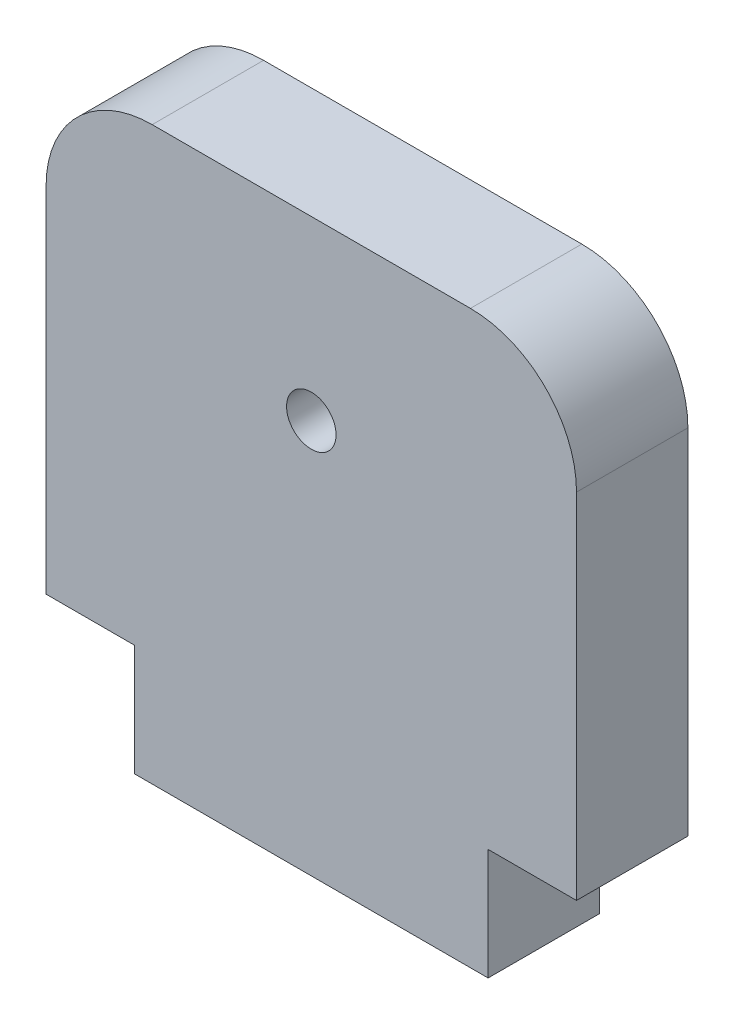
ISO-10303-21;
HEADER;
FILE_DESCRIPTION(('STEP AP214'),'2;1');
FILE_NAME('part.step','',(''),(''),'','','');
FILE_SCHEMA(('AUTOMOTIVE_DESIGN { 1 0 10303 214 1 1 1 1 }'));
ENDSEC;
DATA;
#1=APPLICATION_CONTEXT('core data for automotive mechanical design processes');
#2=APPLICATION_PROTOCOL_DEFINITION('international standard','automotive_design',2000,#1);
#3=PRODUCT_CONTEXT('',#1,'mechanical');
#4=PRODUCT('Part','Part','',(#3));
#5=PRODUCT_RELATED_PRODUCT_CATEGORY('part','',(#4));
#6=PRODUCT_DEFINITION_FORMATION('','',#4);
#7=PRODUCT_DEFINITION_CONTEXT('part definition',#1,'design');
#8=PRODUCT_DEFINITION('design','',#6,#7);
#9=PRODUCT_DEFINITION_SHAPE('','',#8);
#10=(LENGTH_UNIT() NAMED_UNIT(*) SI_UNIT(.MILLI.,.METRE.));
#11=(NAMED_UNIT(*) PLANE_ANGLE_UNIT() SI_UNIT($,.RADIAN.));
#12=(NAMED_UNIT(*) SI_UNIT($,.STERADIAN.) SOLID_ANGLE_UNIT());
#13=UNCERTAINTY_MEASURE_WITH_UNIT(LENGTH_MEASURE(1.E-05),#10,'distance_accuracy_value','');
#14=(GEOMETRIC_REPRESENTATION_CONTEXT(3) GLOBAL_UNCERTAINTY_ASSIGNED_CONTEXT((#13)) GLOBAL_UNIT_ASSIGNED_CONTEXT((#10,
#11,#12)) REPRESENTATION_CONTEXT('',''));
#15=CARTESIAN_POINT('',(0.,0.,0.));
#16=DIRECTION('',(0.,0.,1.));
#17=DIRECTION('',(1.,0.,0.));
#18=AXIS2_PLACEMENT_3D('',#15,#16,#17);
#19=CARTESIAN_POINT('',(-5.715,4.445,4.));
#20=DIRECTION('',(0.,0.,-1.));
#21=DIRECTION('',(-1.,0.,0.));
#22=AXIS2_PLACEMENT_3D('',#19,#20,#21);
#23=PLANE('',#22);
#24=DIRECTION('',(0.,-1.,0.));
#25=VECTOR('',#24,1.);
#26=CARTESIAN_POINT('',(-9.525,-8.255,4.));
#27=LINE('',#26,#25);
#28=CARTESIAN_POINT('',(-9.525,4.445,4.));
#29=VERTEX_POINT('',#28);
#30=CARTESIAN_POINT('',(-9.525,-8.255,4.));
#31=VERTEX_POINT('',#30);
#32=EDGE_CURVE('E193',#29,#31,#27,.T.);
#33=ORIENTED_EDGE('',*,*,#32,.T.);
#34=DIRECTION('',(1.,0.,0.));
#35=VECTOR('',#34,1.);
#36=CARTESIAN_POINT('',(-9.525,-8.255,4.));
#37=LINE('',#36,#35);
#38=CARTESIAN_POINT('',(-6.35,-8.255,4.));
#39=VERTEX_POINT('',#38);
#40=EDGE_CURVE('E113',#31,#39,#37,.T.);
#41=ORIENTED_EDGE('',*,*,#40,.T.);
#42=DIRECTION('',(0.,-1.,0.));
#43=VECTOR('',#42,1.);
#44=CARTESIAN_POINT('',(-6.35,-8.255,4.));
#45=LINE('',#44,#43);
#46=CARTESIAN_POINT('',(-6.35,-12.255,4.));
#47=VERTEX_POINT('',#46);
#48=EDGE_CURVE('E187',#39,#47,#45,.T.);
#49=ORIENTED_EDGE('',*,*,#48,.T.);
#50=DIRECTION('',(1.,0.,0.));
#51=VECTOR('',#50,1.);
#52=CARTESIAN_POINT('',(-6.35,-12.255,4.));
#53=LINE('',#52,#51);
#54=CARTESIAN_POINT('',(6.35,-12.255,4.));
#55=VERTEX_POINT('',#54);
#56=EDGE_CURVE('E179',#47,#55,#53,.T.);
#57=ORIENTED_EDGE('',*,*,#56,.T.);
#58=DIRECTION('',(0.,1.,0.));
#59=VECTOR('',#58,1.);
#60=CARTESIAN_POINT('',(6.35,-12.255,4.));
#61=LINE('',#60,#59);
#62=CARTESIAN_POINT('',(6.35,-8.255,4.));
#63=VERTEX_POINT('',#62);
#64=EDGE_CURVE('E175',#55,#63,#61,.T.);
#65=ORIENTED_EDGE('',*,*,#64,.T.);
#66=DIRECTION('',(1.,0.,0.));
#67=VECTOR('',#66,1.);
#68=CARTESIAN_POINT('',(6.35,-8.255,4.));
#69=LINE('',#68,#67);
#70=CARTESIAN_POINT('',(9.525,-8.255,4.));
#71=VERTEX_POINT('',#70);
#72=EDGE_CURVE('E171',#63,#71,#69,.T.);
#73=ORIENTED_EDGE('',*,*,#72,.T.);
#74=DIRECTION('',(0.,1.,0.));
#75=VECTOR('',#74,1.);
#76=CARTESIAN_POINT('',(9.525,-8.255,4.));
#77=LINE('',#76,#75);
#78=CARTESIAN_POINT('',(9.525,4.445,4.));
#79=VERTEX_POINT('',#78);
#80=EDGE_CURVE('E138',#71,#79,#77,.T.);
#81=ORIENTED_EDGE('',*,*,#80,.T.);
#82=CARTESIAN_POINT('',(5.715,4.445,4.));
#83=DIRECTION('',(0.,0.,1.));
#84=DIRECTION('',(-1.,0.,0.));
#85=AXIS2_PLACEMENT_3D('',#82,#83,#84);
#86=CIRCLE('',#85,3.81);
#87=CARTESIAN_POINT('',(5.715,8.255,4.));
#88=VERTEX_POINT('',#87);
#89=EDGE_CURVE('E132',#79,#88,#86,.T.);
#90=ORIENTED_EDGE('',*,*,#89,.T.);
#91=DIRECTION('',(-1.,0.,0.));
#92=VECTOR('',#91,1.);
#93=CARTESIAN_POINT('',(-5.715,8.255,4.));
#94=LINE('',#93,#92);
#95=CARTESIAN_POINT('',(-5.715,8.255,4.));
#96=VERTEX_POINT('',#95);
#97=EDGE_CURVE('E136',#88,#96,#94,.T.);
#98=ORIENTED_EDGE('',*,*,#97,.T.);
#99=CARTESIAN_POINT('',(-5.715,4.445,4.));
#100=DIRECTION('',(0.,0.,1.));
#101=DIRECTION('',(-1.,0.,0.));
#102=AXIS2_PLACEMENT_3D('',#99,#100,#101);
#103=CIRCLE('',#102,3.81);
#104=EDGE_CURVE('E64',#96,#29,#103,.T.);
#105=ORIENTED_EDGE('',*,*,#104,.T.);
#106=EDGE_LOOP('',(#33,#41,#49,#57,#65,#73,#81,#90,#98,#105));
#107=FACE_BOUND('',#106,.T.);
#108=CARTESIAN_POINT('',(0.,1.905,4.));
#109=DIRECTION('',(0.,0.,1.));
#110=DIRECTION('',(1.,0.,0.));
#111=AXIS2_PLACEMENT_3D('',#108,#109,#110);
#112=CIRCLE('',#111,0.889);
#113=CARTESIAN_POINT('',(0.889000000000002,1.905,4.));
#114=VERTEX_POINT('',#113);
#115=EDGE_CURVE('E200',#114,#114,#112,.T.);
#116=ORIENTED_EDGE('',*,*,#115,.F.);
#117=EDGE_LOOP('',(#116));
#118=FACE_BOUND('',#117,.T.);
#119=ADVANCED_FACE('F46',(#107,#118),#23,.F.);
#120=CARTESIAN_POINT('',(-5.715,4.445,0.));
#121=DIRECTION('',(0.,0.,-1.));
#122=DIRECTION('',(-1.,0.,0.));
#123=AXIS2_PLACEMENT_3D('',#120,#121,#122);
#124=PLANE('',#123);
#125=DIRECTION('',(0.,-1.,0.));
#126=VECTOR('',#125,1.);
#127=CARTESIAN_POINT('',(-9.525,-8.255,0.));
#128=LINE('',#127,#126);
#129=CARTESIAN_POINT('',(-9.525,4.445,0.));
#130=VERTEX_POINT('',#129);
#131=CARTESIAN_POINT('',(-9.525,-8.255,0.));
#132=VERTEX_POINT('',#131);
#133=EDGE_CURVE('E204',#130,#132,#128,.T.);
#134=ORIENTED_EDGE('',*,*,#133,.F.);
#135=CARTESIAN_POINT('',(-5.715,4.445,0.));
#136=DIRECTION('',(0.,0.,1.));
#137=DIRECTION('',(-1.,0.,0.));
#138=AXIS2_PLACEMENT_3D('',#135,#136,#137);
#139=CIRCLE('',#138,3.81);
#140=CARTESIAN_POINT('',(-5.715,8.255,0.));
#141=VERTEX_POINT('',#140);
#142=EDGE_CURVE('E105',#141,#130,#139,.T.);
#143=ORIENTED_EDGE('',*,*,#142,.F.);
#144=DIRECTION('',(-1.,0.,0.));
#145=VECTOR('',#144,1.);
#146=CARTESIAN_POINT('',(-5.715,8.255,0.));
#147=LINE('',#146,#145);
#148=CARTESIAN_POINT('',(5.715,8.255,0.));
#149=VERTEX_POINT('',#148);
#150=EDGE_CURVE('E99',#149,#141,#147,.T.);
#151=ORIENTED_EDGE('',*,*,#150,.F.);
#152=CARTESIAN_POINT('',(5.715,4.445,0.));
#153=DIRECTION('',(0.,0.,1.));
#154=DIRECTION('',(-1.,0.,0.));
#155=AXIS2_PLACEMENT_3D('',#152,#153,#154);
#156=CIRCLE('',#155,3.81);
#157=CARTESIAN_POINT('',(9.525,4.445,0.));
#158=VERTEX_POINT('',#157);
#159=EDGE_CURVE('E147',#158,#149,#156,.T.);
#160=ORIENTED_EDGE('',*,*,#159,.F.);
#161=DIRECTION('',(0.,1.,0.));
#162=VECTOR('',#161,1.);
#163=CARTESIAN_POINT('',(9.525,-8.255,0.));
#164=LINE('',#163,#162);
#165=CARTESIAN_POINT('',(9.525,-8.255,0.));
#166=VERTEX_POINT('',#165);
#167=EDGE_CURVE('E228',#166,#158,#164,.T.);
#168=ORIENTED_EDGE('',*,*,#167,.F.);
#169=DIRECTION('',(1.,0.,0.));
#170=VECTOR('',#169,1.);
#171=CARTESIAN_POINT('',(6.35,-8.255,0.));
#172=LINE('',#171,#170);
#173=CARTESIAN_POINT('',(6.35,-8.255,0.));
#174=VERTEX_POINT('',#173);
#175=EDGE_CURVE('E225',#174,#166,#172,.T.);
#176=ORIENTED_EDGE('',*,*,#175,.F.);
#177=DIRECTION('',(0.,1.,0.));
#178=VECTOR('',#177,1.);
#179=CARTESIAN_POINT('',(6.35,-12.255,0.));
#180=LINE('',#179,#178);
#181=CARTESIAN_POINT('',(6.35,-12.255,0.));
#182=VERTEX_POINT('',#181);
#183=EDGE_CURVE('E222',#182,#174,#180,.T.);
#184=ORIENTED_EDGE('',*,*,#183,.F.);
#185=DIRECTION('',(1.,0.,0.));
#186=VECTOR('',#185,1.);
#187=CARTESIAN_POINT('',(-6.35,-12.255,0.));
#188=LINE('',#187,#186);
#189=CARTESIAN_POINT('',(-6.35,-12.255,0.));
#190=VERTEX_POINT('',#189);
#191=EDGE_CURVE('E219',#190,#182,#188,.T.);
#192=ORIENTED_EDGE('',*,*,#191,.F.);
#193=DIRECTION('',(0.,-1.,0.));
#194=VECTOR('',#193,1.);
#195=CARTESIAN_POINT('',(-6.35,-8.255,0.));
#196=LINE('',#195,#194);
#197=CARTESIAN_POINT('',(-6.35,-8.255,0.));
#198=VERTEX_POINT('',#197);
#199=EDGE_CURVE('E214',#198,#190,#196,.T.);
#200=ORIENTED_EDGE('',*,*,#199,.F.);
#201=DIRECTION('',(1.,0.,0.));
#202=VECTOR('',#201,1.);
#203=CARTESIAN_POINT('',(-9.525,-8.255,0.));
#204=LINE('',#203,#202);
#205=EDGE_CURVE('E209',#132,#198,#204,.T.);
#206=ORIENTED_EDGE('',*,*,#205,.F.);
#207=EDGE_LOOP('',(#134,#143,#151,#160,#168,#176,#184,#192,#200,#206));
#208=FACE_BOUND('',#207,.T.);
#209=CARTESIAN_POINT('',(0.,1.905,0.));
#210=DIRECTION('',(0.,0.,1.));
#211=DIRECTION('',(1.,0.,0.));
#212=AXIS2_PLACEMENT_3D('',#209,#210,#211);
#213=CIRCLE('',#212,0.889);
#214=CARTESIAN_POINT('',(0.889000000000002,1.905,0.));
#215=VERTEX_POINT('',#214);
#216=EDGE_CURVE('E197',#215,#215,#213,.T.);
#217=ORIENTED_EDGE('',*,*,#216,.T.);
#218=EDGE_LOOP('',(#217));
#219=FACE_BOUND('',#218,.T.);
#220=ADVANCED_FACE('F267',(#208,#219),#124,.T.);
#221=CARTESIAN_POINT('',(-9.525,-8.255,4.));
#222=DIRECTION('',(1.,0.,0.));
#223=DIRECTION('',(0.,1.,0.));
#224=AXIS2_PLACEMENT_3D('',#221,#222,#223);
#225=PLANE('',#224);
#226=ORIENTED_EDGE('',*,*,#133,.T.);
#227=DIRECTION('',(0.,0.,-1.));
#228=VECTOR('',#227,1.);
#229=CARTESIAN_POINT('',(-9.525,-8.255,4.));
#230=LINE('',#229,#228);
#231=EDGE_CURVE('E12',#31,#132,#230,.T.);
#232=ORIENTED_EDGE('',*,*,#231,.F.);
#233=ORIENTED_EDGE('',*,*,#32,.F.);
#234=DIRECTION('',(0.,0.,-1.));
#235=VECTOR('',#234,1.);
#236=CARTESIAN_POINT('',(-9.525,4.445,4.));
#237=LINE('',#236,#235);
#238=EDGE_CURVE('E156',#29,#130,#237,.T.);
#239=ORIENTED_EDGE('',*,*,#238,.T.);
#240=EDGE_LOOP('',(#226,#232,#233,#239));
#241=FACE_BOUND('',#240,.T.);
#242=ADVANCED_FACE('F48',(#241),#225,.F.);
#243=CARTESIAN_POINT('',(-9.525,-8.255,4.));
#244=DIRECTION('',(0.,1.,0.));
#245=DIRECTION('',(0.,0.,1.));
#246=AXIS2_PLACEMENT_3D('',#243,#244,#245);
#247=PLANE('',#246);
#248=ORIENTED_EDGE('',*,*,#205,.T.);
#249=DIRECTION('',(0.,0.,-1.));
#250=VECTOR('',#249,1.);
#251=CARTESIAN_POINT('',(-6.35,-8.255,4.));
#252=LINE('',#251,#250);
#253=EDGE_CURVE('E56',#39,#198,#252,.T.);
#254=ORIENTED_EDGE('',*,*,#253,.F.);
#255=ORIENTED_EDGE('',*,*,#40,.F.);
#256=ORIENTED_EDGE('',*,*,#231,.T.);
#257=EDGE_LOOP('',(#248,#254,#255,#256));
#258=FACE_BOUND('',#257,.T.);
#259=ADVANCED_FACE('F283',(#258),#247,.F.);
#260=CARTESIAN_POINT('',(-6.35,-8.255,4.));
#261=DIRECTION('',(1.,0.,0.));
#262=DIRECTION('',(0.,0.,-1.));
#263=AXIS2_PLACEMENT_3D('',#260,#261,#262);
#264=PLANE('',#263);
#265=ORIENTED_EDGE('',*,*,#199,.T.);
#266=DIRECTION('',(0.,0.,-1.));
#267=VECTOR('',#266,1.);
#268=CARTESIAN_POINT('',(-6.35,-12.255,4.));
#269=LINE('',#268,#267);
#270=EDGE_CURVE('E255',#47,#190,#269,.T.);
#271=ORIENTED_EDGE('',*,*,#270,.F.);
#272=ORIENTED_EDGE('',*,*,#48,.F.);
#273=ORIENTED_EDGE('',*,*,#253,.T.);
#274=EDGE_LOOP('',(#265,#271,#272,#273));
#275=FACE_BOUND('',#274,.T.);
#276=ADVANCED_FACE('F263',(#275),#264,.F.);
#277=CARTESIAN_POINT('',(-6.35,-12.255,4.));
#278=DIRECTION('',(0.,1.,0.));
#279=DIRECTION('',(0.,0.,1.));
#280=AXIS2_PLACEMENT_3D('',#277,#278,#279);
#281=PLANE('',#280);
#282=ORIENTED_EDGE('',*,*,#191,.T.);
#283=DIRECTION('',(0.,0.,-1.));
#284=VECTOR('',#283,1.);
#285=CARTESIAN_POINT('',(6.35,-12.255,4.));
#286=LINE('',#285,#284);
#287=EDGE_CURVE('E251',#55,#182,#286,.T.);
#288=ORIENTED_EDGE('',*,*,#287,.F.);
#289=ORIENTED_EDGE('',*,*,#56,.F.);
#290=ORIENTED_EDGE('',*,*,#270,.T.);
#291=EDGE_LOOP('',(#282,#288,#289,#290));
#292=FACE_BOUND('',#291,.T.);
#293=ADVANCED_FACE('F273',(#292),#281,.F.);
#294=CARTESIAN_POINT('',(6.35,-12.255,4.));
#295=DIRECTION('',(-1.,0.,0.));
#296=DIRECTION('',(0.,0.,1.));
#297=AXIS2_PLACEMENT_3D('',#294,#295,#296);
#298=PLANE('',#297);
#299=ORIENTED_EDGE('',*,*,#183,.T.);
#300=DIRECTION('',(0.,0.,-1.));
#301=VECTOR('',#300,1.);
#302=CARTESIAN_POINT('',(6.35,-8.255,4.));
#303=LINE('',#302,#301);
#304=EDGE_CURVE('E247',#63,#174,#303,.T.);
#305=ORIENTED_EDGE('',*,*,#304,.F.);
#306=ORIENTED_EDGE('',*,*,#64,.F.);
#307=ORIENTED_EDGE('',*,*,#287,.T.);
#308=EDGE_LOOP('',(#299,#305,#306,#307));
#309=FACE_BOUND('',#308,.T.);
#310=ADVANCED_FACE('F277',(#309),#298,.F.);
#311=CARTESIAN_POINT('',(6.35,-8.255,4.));
#312=DIRECTION('',(0.,1.,0.));
#313=DIRECTION('',(0.,0.,1.));
#314=AXIS2_PLACEMENT_3D('',#311,#312,#313);
#315=PLANE('',#314);
#316=ORIENTED_EDGE('',*,*,#175,.T.);
#317=DIRECTION('',(0.,0.,-1.));
#318=VECTOR('',#317,1.);
#319=CARTESIAN_POINT('',(9.525,-8.255,4.));
#320=LINE('',#319,#318);
#321=EDGE_CURVE('E243',#71,#166,#320,.T.);
#322=ORIENTED_EDGE('',*,*,#321,.F.);
#323=ORIENTED_EDGE('',*,*,#72,.F.);
#324=ORIENTED_EDGE('',*,*,#304,.T.);
#325=EDGE_LOOP('',(#316,#322,#323,#324));
#326=FACE_BOUND('',#325,.T.);
#327=ADVANCED_FACE('F309',(#326),#315,.F.);
#328=CARTESIAN_POINT('',(9.525,-8.255,4.));
#329=DIRECTION('',(-1.,0.,0.));
#330=DIRECTION('',(0.,-1.,0.));
#331=AXIS2_PLACEMENT_3D('',#328,#329,#330);
#332=PLANE('',#331);
#333=ORIENTED_EDGE('',*,*,#167,.T.);
#334=DIRECTION('',(0.,0.,-1.));
#335=VECTOR('',#334,1.);
#336=CARTESIAN_POINT('',(9.525,4.445,4.));
#337=LINE('',#336,#335);
#338=EDGE_CURVE('E149',#79,#158,#337,.T.);
#339=ORIENTED_EDGE('',*,*,#338,.F.);
#340=ORIENTED_EDGE('',*,*,#80,.F.);
#341=ORIENTED_EDGE('',*,*,#321,.T.);
#342=EDGE_LOOP('',(#333,#339,#340,#341));
#343=FACE_BOUND('',#342,.T.);
#344=ADVANCED_FACE('F306',(#343),#332,.F.);
#345=CARTESIAN_POINT('',(5.715,4.445,4.));
#346=DIRECTION('',(0.,0.,-1.));
#347=DIRECTION('',(-1.,0.,0.));
#348=AXIS2_PLACEMENT_3D('',#345,#346,#347);
#349=CYLINDRICAL_SURFACE('',#348,3.81);
#350=ORIENTED_EDGE('',*,*,#159,.T.);
#351=DIRECTION('',(0.,0.,-1.));
#352=VECTOR('',#351,1.);
#353=CARTESIAN_POINT('',(5.715,8.255,4.));
#354=LINE('',#353,#352);
#355=EDGE_CURVE('E144',#88,#149,#354,.T.);
#356=ORIENTED_EDGE('',*,*,#355,.F.);
#357=ORIENTED_EDGE('',*,*,#89,.F.);
#358=ORIENTED_EDGE('',*,*,#338,.T.);
#359=EDGE_LOOP('',(#350,#356,#357,#358));
#360=FACE_BOUND('',#359,.T.);
#361=ADVANCED_FACE('F145',(#360),#349,.T.);
#362=CARTESIAN_POINT('',(-5.715,8.255,4.));
#363=DIRECTION('',(0.,-1.,0.));
#364=DIRECTION('',(0.,0.,-1.));
#365=AXIS2_PLACEMENT_3D('',#362,#363,#364);
#366=PLANE('',#365);
#367=ORIENTED_EDGE('',*,*,#150,.T.);
#368=DIRECTION('',(0.,0.,-1.));
#369=VECTOR('',#368,1.);
#370=CARTESIAN_POINT('',(-5.715,8.255,4.));
#371=LINE('',#370,#369);
#372=EDGE_CURVE('E150',#96,#141,#371,.T.);
#373=ORIENTED_EDGE('',*,*,#372,.F.);
#374=ORIENTED_EDGE('',*,*,#97,.F.);
#375=ORIENTED_EDGE('',*,*,#355,.T.);
#376=EDGE_LOOP('',(#367,#373,#374,#375));
#377=FACE_BOUND('',#376,.T.);
#378=ADVANCED_FACE('F152',(#377),#366,.F.);
#379=CARTESIAN_POINT('',(-5.715,4.445,4.));
#380=DIRECTION('',(0.,0.,-1.));
#381=DIRECTION('',(-1.,0.,0.));
#382=AXIS2_PLACEMENT_3D('',#379,#380,#381);
#383=CYLINDRICAL_SURFACE('',#382,3.81);
#384=ORIENTED_EDGE('',*,*,#142,.T.);
#385=ORIENTED_EDGE('',*,*,#238,.F.);
#386=ORIENTED_EDGE('',*,*,#104,.F.);
#387=ORIENTED_EDGE('',*,*,#372,.T.);
#388=EDGE_LOOP('',(#384,#385,#386,#387));
#389=FACE_BOUND('',#388,.T.);
#390=ADVANCED_FACE('F299',(#389),#383,.T.);
#391=CARTESIAN_POINT('',(0.,1.905,4.));
#392=DIRECTION('',(0.,0.,-1.));
#393=DIRECTION('',(-1.,0.,0.));
#394=AXIS2_PLACEMENT_3D('',#391,#392,#393);
#395=CYLINDRICAL_SURFACE('',#394,0.889);
#396=ORIENTED_EDGE('',*,*,#115,.T.);
#397=EDGE_LOOP('',(#396));
#398=FACE_BOUND('',#397,.T.);
#399=ORIENTED_EDGE('',*,*,#216,.F.);
#400=EDGE_LOOP('',(#399));
#401=FACE_BOUND('',#400,.T.);
#402=ADVANCED_FACE('F297',(#398,#401),#395,.F.);
#403=CLOSED_SHELL('',(#119,#220,#242,#259,#276,#293,#310,#327,#344,#361,#378,#390,#402));
#404=MANIFOLD_SOLID_BREP('B2',#403);
#405=ADVANCED_BREP_SHAPE_REPRESENTATION('',(#18,#404),#14);
#406=SHAPE_DEFINITION_REPRESENTATION(#9,#405);
ENDSEC;
END-ISO-10303-21;
